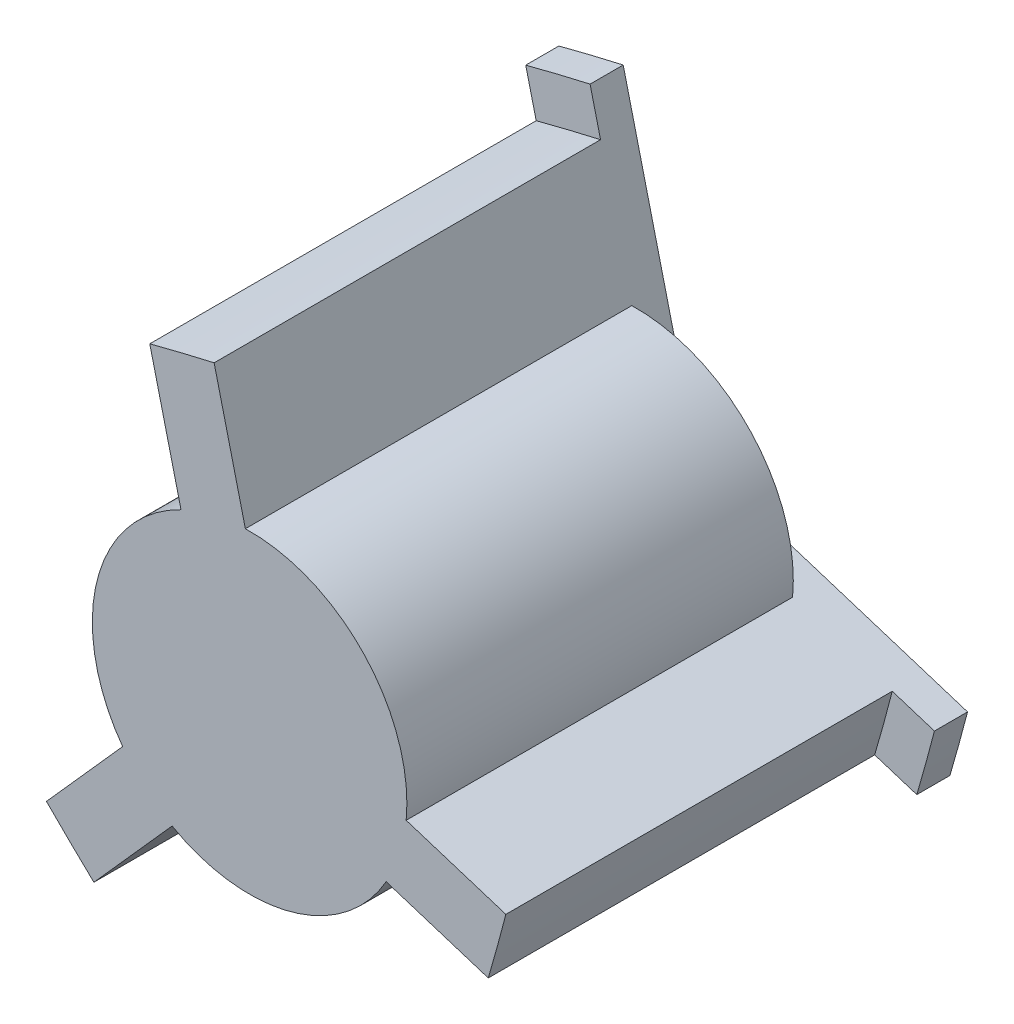
ISO-10303-21;
HEADER;
FILE_DESCRIPTION(('STEP AP214'),'2;1');
FILE_NAME('part.step','',(''),(''),'','','');
FILE_SCHEMA(('AUTOMOTIVE_DESIGN { 1 0 10303 214 1 1 1 1 }'));
ENDSEC;
DATA;
#1=APPLICATION_CONTEXT('core data for automotive mechanical design processes');
#2=APPLICATION_PROTOCOL_DEFINITION('international standard','automotive_design',2000,#1);
#3=PRODUCT_CONTEXT('',#1,'mechanical');
#4=PRODUCT('Part','Part','',(#3));
#5=PRODUCT_RELATED_PRODUCT_CATEGORY('part','',(#4));
#6=PRODUCT_DEFINITION_FORMATION('','',#4);
#7=PRODUCT_DEFINITION_CONTEXT('part definition',#1,'design');
#8=PRODUCT_DEFINITION('design','',#6,#7);
#9=PRODUCT_DEFINITION_SHAPE('','',#8);
#10=(LENGTH_UNIT() NAMED_UNIT(*) SI_UNIT(.MILLI.,.METRE.));
#11=(NAMED_UNIT(*) PLANE_ANGLE_UNIT() SI_UNIT($,.RADIAN.));
#12=(NAMED_UNIT(*) SI_UNIT($,.STERADIAN.) SOLID_ANGLE_UNIT());
#13=UNCERTAINTY_MEASURE_WITH_UNIT(LENGTH_MEASURE(1.E-05),#10,'distance_accuracy_value','');
#14=(GEOMETRIC_REPRESENTATION_CONTEXT(3) GLOBAL_UNCERTAINTY_ASSIGNED_CONTEXT((#13)) GLOBAL_UNIT_ASSIGNED_CONTEXT((#10,
#11,#12)) REPRESENTATION_CONTEXT('',''));
#15=CARTESIAN_POINT('',(0.,0.,0.));
#16=DIRECTION('',(0.,0.,1.));
#17=DIRECTION('',(1.,0.,0.));
#18=AXIS2_PLACEMENT_3D('',#15,#16,#17);
#19=CARTESIAN_POINT('',(0.,0.,-10.));
#20=DIRECTION('',(0.,0.,1.));
#21=DIRECTION('',(1.,0.,0.));
#22=AXIS2_PLACEMENT_3D('',#19,#20,#21);
#23=PLANE('',#22);
#24=DIRECTION('',(-0.236920909085542,0.971528940813438,0.));
#25=VECTOR('',#24,1.);
#26=CARTESIAN_POINT('',(118.726396637085,28.9530909909459,-10.));
#27=LINE('',#26,#25);
#28=CARTESIAN_POINT('',(85.7576937415388,164.146093279056,-10.));
#29=VERTEX_POINT('',#28);
#30=CARTESIAN_POINT('',(82.8313934331884,176.145816942311,-10.));
#31=VERTEX_POINT('',#30);
#32=EDGE_CURVE('E58',#29,#31,#27,.T.);
#33=ORIENTED_EDGE('',*,*,#32,.F.);
#34=DIRECTION('',(0.665010125091396,0.746834341421125,0.));
#35=VECTOR('',#34,1.);
#36=CARTESIAN_POINT('',(-33.691208209572,29.9999522562046,-10.));
#37=LINE('',#36,#35);
#38=CARTESIAN_POINT('',(77.54390061698,154.921658120409,-10.));
#39=VERTEX_POINT('',#38);
#40=EDGE_CURVE('E11',#39,#29,#37,.T.);
#41=ORIENTED_EDGE('',*,*,#40,.F.);
#42=CARTESIAN_POINT('',(89.0453442626024,163.327053586685,-10.));
#43=DIRECTION('',(0.,0.,1.));
#44=DIRECTION('',(1.,0.,0.));
#45=AXIS2_PLACEMENT_3D('',#42,#43,#44);
#46=CIRCLE('',#45,14.2454862633017);
#47=EDGE_CURVE('E410',#39,#31,#46,.F.);
#48=ORIENTED_EDGE('',*,*,#47,.T.);
#49=EDGE_LOOP('',(#33,#41,#48));
#50=FACE_BOUND('',#49,.T.);
#51=ADVANCED_FACE('F39',(#50),#23,.F.);
#52=DIRECTION('',(0.953254848048055,-0.302167494401498,0.));
#53=VECTOR('',#52,1.);
#54=CARTESIAN_POINT('',(56.0819588713388,176.923064765865,-10.));
#55=LINE('',#54,#53);
#56=CARTESIAN_POINT('',(91.560194185412,165.676996106899,-10.));
#57=VERTEX_POINT('',#56);
#58=CARTESIAN_POINT('',(103.226887548505,161.978829232957,-10.));
#59=VERTEX_POINT('',#58);
#60=EDGE_CURVE('E455',#57,#59,#55,.T.);
#61=ORIENTED_EDGE('',*,*,#60,.F.);
#62=DIRECTION('',(-0.236920909085542,0.971528940813438,0.));
#63=VECTOR('',#62,1.);
#64=CARTESIAN_POINT('',(124.555570281965,30.3746164454591,-10.));
#65=LINE('',#64,#63);
#66=CARTESIAN_POINT('',(88.6605670780691,177.567342396824,-10.));
#67=VERTEX_POINT('',#66);
#68=EDGE_CURVE('E213',#57,#67,#65,.T.);
#69=ORIENTED_EDGE('',*,*,#68,.T.);
#70=EDGE_CURVE('E411',#67,#59,#46,.F.);
#71=ORIENTED_EDGE('',*,*,#70,.T.);
#72=EDGE_LOOP('',(#61,#69,#71));
#73=FACE_BOUND('',#72,.T.);
#74=ADVANCED_FACE('F366',(#73),#23,.F.);
#75=CARTESIAN_POINT('',(89.0453442626024,163.327053586685,25.));
#76=DIRECTION('',(0.,0.,-1.));
#77=DIRECTION('',(-1.,0.,0.));
#78=AXIS2_PLACEMENT_3D('',#75,#76,#77);
#79=CYLINDRICAL_SURFACE('',#78,14.2454862633017);
#80=DIRECTION('',(0.,0.,1.));
#81=VECTOR('',#80,1.);
#82=CARTESIAN_POINT('',(77.54390061698,154.921658120409,-26.4995458220875));
#83=LINE('',#82,#81);
#84=CARTESIAN_POINT('',(77.54390061698,154.921658120409,25.));
#85=VERTEX_POINT('',#84);
#86=EDGE_CURVE('E253',#39,#85,#83,.T.);
#87=ORIENTED_EDGE('',*,*,#86,.T.);
#88=CARTESIAN_POINT('',(89.0453442626024,163.327053586685,25.));
#89=DIRECTION('',(0.,0.,1.));
#90=DIRECTION('',(1.,0.,0.));
#91=AXIS2_PLACEMENT_3D('',#88,#89,#90);
#92=CIRCLE('',#91,14.2454862633017);
#93=CARTESIAN_POINT('',(82.8313934331884,176.145816942311,25.));
#94=VERTEX_POINT('',#93);
#95=EDGE_CURVE('E348',#94,#85,#92,.T.);
#96=ORIENTED_EDGE('',*,*,#95,.F.);
#97=DIRECTION('',(0.,0.,1.));
#98=VECTOR('',#97,1.);
#99=CARTESIAN_POINT('',(82.8313934331884,176.145816942311,-26.4995458220875));
#100=LINE('',#99,#98);
#101=EDGE_CURVE('E402',#31,#94,#100,.T.);
#102=ORIENTED_EDGE('',*,*,#101,.F.);
#103=ORIENTED_EDGE('',*,*,#47,.F.);
#104=EDGE_LOOP('',(#87,#96,#102,#103));
#105=FACE_BOUND('',#104,.T.);
#106=ADVANCED_FACE('F425',(#105),#79,.T.);
#107=DIRECTION('',(0.,0.,1.));
#108=VECTOR('',#107,1.);
#109=CARTESIAN_POINT('',(103.226887548505,161.978829232957,-26.4995458220875));
#110=LINE('',#109,#108);
#111=CARTESIAN_POINT('',(103.226887548505,161.978829232957,25.));
#112=VERTEX_POINT('',#111);
#113=EDGE_CURVE('E329',#59,#112,#110,.T.);
#114=ORIENTED_EDGE('',*,*,#113,.F.);
#115=ORIENTED_EDGE('',*,*,#70,.F.);
#116=DIRECTION('',(0.,0.,1.));
#117=VECTOR('',#116,1.);
#118=CARTESIAN_POINT('',(88.6605670780691,177.567342396824,-26.4995458220875));
#119=LINE('',#118,#117);
#120=CARTESIAN_POINT('',(88.6605670780691,177.567342396824,25.));
#121=VERTEX_POINT('',#120);
#122=EDGE_CURVE('E398',#67,#121,#119,.T.);
#123=ORIENTED_EDGE('',*,*,#122,.T.);
#124=EDGE_CURVE('E416',#112,#121,#92,.T.);
#125=ORIENTED_EDGE('',*,*,#124,.F.);
#126=EDGE_LOOP('',(#114,#115,#123,#125));
#127=FACE_BOUND('',#126,.T.);
#128=ADVANCED_FACE('F543',(#127),#79,.T.);
#129=CARTESIAN_POINT('',(82.0249066655067,150.93159736986,25.));
#130=VERTEX_POINT('',#129);
#131=CARTESIAN_POINT('',(101.413882582096,156.259300144668,25.));
#132=VERTEX_POINT('',#131);
#133=EDGE_CURVE('E419',#130,#132,#92,.T.);
#134=ORIENTED_EDGE('',*,*,#133,.F.);
#135=DIRECTION('',(0.,0.,1.));
#136=VECTOR('',#135,1.);
#137=CARTESIAN_POINT('',(82.0249066655067,150.93159736986,-26.4995458220875));
#138=LINE('',#137,#136);
#139=CARTESIAN_POINT('',(82.0249066655067,150.93159736986,-10.));
#140=VERTEX_POINT('',#139);
#141=EDGE_CURVE('E260',#140,#130,#138,.T.);
#142=ORIENTED_EDGE('',*,*,#141,.F.);
#143=CARTESIAN_POINT('',(101.413882582096,156.259300144668,-10.));
#144=VERTEX_POINT('',#143);
#145=EDGE_CURVE('E417',#144,#140,#46,.F.);
#146=ORIENTED_EDGE('',*,*,#145,.F.);
#147=DIRECTION('',(0.,0.,1.));
#148=VECTOR('',#147,1.);
#149=CARTESIAN_POINT('',(101.413882582096,156.259300144668,-26.4995458220875));
#150=LINE('',#149,#148);
#151=EDGE_CURVE('E287',#144,#132,#150,.T.);
#152=ORIENTED_EDGE('',*,*,#151,.T.);
#153=EDGE_LOOP('',(#134,#142,#146,#152));
#154=FACE_BOUND('',#153,.T.);
#155=ADVANCED_FACE('F41',(#154),#79,.T.);
#156=CARTESIAN_POINT('',(0.,0.,25.));
#157=DIRECTION('',(0.,0.,1.));
#158=DIRECTION('',(1.,0.,0.));
#159=AXIS2_PLACEMENT_3D('',#156,#157,#158);
#160=PLANE('',#159);
#161=ORIENTED_EDGE('',*,*,#95,.T.);
#162=DIRECTION('',(0.665010125091396,0.746834341421125,0.));
#163=VECTOR('',#162,1.);
#164=CARTESIAN_POINT('',(-33.691208209572,29.9999522562046,25.));
#165=LINE('',#164,#163);
#166=CARTESIAN_POINT('',(70.6436131604994,147.172345074282,25.));
#167=VERTEX_POINT('',#166);
#168=EDGE_CURVE('E461',#167,#85,#165,.T.);
#169=ORIENTED_EDGE('',*,*,#168,.F.);
#170=CARTESIAN_POINT('',(74.9408453953819,142.975898601314,25.));
#171=CARTESIAN_POINT('',(73.8993035303231,143.959823605304,25.));
#172=CARTESIAN_POINT('',(72.459478207081,145.352579257154,25.));
#173=CARTESIAN_POINT('',(71.0431270383855,146.769030065245,25.));
#174=CARTESIAN_POINT('',(70.6436131604994,147.172345074282,25.));
#175=B_SPLINE_CURVE_WITH_KNOTS('',3,(#170,#171,#172,#173,#174),.UNSPECIFIED.,.F.,.F.,(4,1,4),
(1.546156508371,1.60843396712121,1.63307378554511),.UNSPECIFIED.);
#176=CARTESIAN_POINT('',(74.9408453953819,142.975898601314,25.));
#177=VERTEX_POINT('',#176);
#178=EDGE_CURVE('E491',#167,#177,#175,.F.);
#179=ORIENTED_EDGE('',*,*,#178,.T.);
#180=DIRECTION('',(0.665010125091396,0.746834341421125,0.));
#181=VECTOR('',#180,1.);
#182=CARTESIAN_POINT('',(-29.2102021610452,26.0098915056562,25.));
#183=LINE('',#182,#181);
#184=EDGE_CURVE('E271',#177,#130,#183,.T.);
#185=ORIENTED_EDGE('',*,*,#184,.T.);
#186=ORIENTED_EDGE('',*,*,#133,.T.);
#187=DIRECTION('',(0.953254848048055,-0.302167494401497,0.));
#188=VECTOR('',#187,1.);
#189=CARTESIAN_POINT('',(54.2689539049296,171.203535677576,25.));
#190=LINE('',#189,#188);
#191=CARTESIAN_POINT('',(110.663241636882,153.327392002656,25.));
#192=VERTEX_POINT('',#191);
#193=EDGE_CURVE('E279',#132,#192,#190,.T.);
#194=ORIENTED_EDGE('',*,*,#193,.T.);
#195=CARTESIAN_POINT('',(112.254907626307,159.117082228048,25.));
#196=CARTESIAN_POINT('',(112.092237308255,158.484885528643,25.));
#197=CARTESIAN_POINT('',(111.582887137087,156.548361076597,25.));
#198=CARTESIAN_POINT('',(111.041647466897,154.620407925623,25.));
#199=CARTESIAN_POINT('',(110.663241636882,153.327392002656,25.));
#200=B_SPLINE_CURVE_WITH_KNOTS('',3,(#195,#196,#197,#198,#199),.UNSPECIFIED.,.F.,.F.,(4,1,4),
(1.51148159125971,1.54018762565238,1.59950236118757),.UNSPECIFIED.);
#201=CARTESIAN_POINT('',(112.254907626307,159.117082228048,25.));
#202=VERTEX_POINT('',#201);
#203=EDGE_CURVE('E315',#192,#202,#200,.F.);
#204=ORIENTED_EDGE('',*,*,#203,.T.);
#205=DIRECTION('',(0.953254848048055,-0.302167494401498,0.));
#206=VECTOR('',#205,1.);
#207=CARTESIAN_POINT('',(56.0819588713388,176.923064765865,25.));
#208=LINE('',#207,#206);
#209=EDGE_CURVE('E318',#112,#202,#208,.T.);
#210=ORIENTED_EDGE('',*,*,#209,.F.);
#211=ORIENTED_EDGE('',*,*,#124,.T.);
#212=DIRECTION('',(-0.236920909085542,0.971528940813438,0.));
#213=VECTOR('',#212,1.);
#214=CARTESIAN_POINT('',(124.555570281965,30.3746164454591,25.));
#215=LINE('',#214,#213);
#216=CARTESIAN_POINT('',(85.8313073021829,189.16913712217,25.));
#217=VERTEX_POINT('',#216);
#218=EDGE_CURVE('E380',#121,#217,#215,.T.);
#219=ORIENTED_EDGE('',*,*,#218,.T.);
#220=CARTESIAN_POINT('',(94.9378095260407,190.97441555604,25.));
#221=CARTESIAN_POINT('',(90.9321454966325,190.292183089886,25.));
#222=CARTESIAN_POINT('',(82.9657609262838,188.642806916523,25.));
#223=CARTESIAN_POINT('',(75.1355111940448,186.43678538607,25.));
#224=CARTESIAN_POINT('',(71.3640226827698,185.232339724771,25.));
#225=B_SPLINE_CURVE_WITH_KNOTS('',3,(#220,#221,#222,#223,#224),.UNSPECIFIED.,.F.,.F.,(4,1,4),
(4.53464312649313,4.71238898038469,4.88545253413385),.UNSPECIFIED.);
#226=CARTESIAN_POINT('',(80.0029316180863,187.744339512411,25.));
#227=VERTEX_POINT('',#226);
#228=EDGE_CURVE('E386',#217,#227,#225,.T.);
#229=ORIENTED_EDGE('',*,*,#228,.T.);
#230=DIRECTION('',(-0.236920909085542,0.971528940813438,0.));
#231=VECTOR('',#230,1.);
#232=CARTESIAN_POINT('',(118.726396637085,28.9530909909459,25.));
#233=LINE('',#232,#231);
#234=EDGE_CURVE('E391',#94,#227,#233,.T.);
#235=ORIENTED_EDGE('',*,*,#234,.F.);
#236=EDGE_LOOP('',(#161,#169,#179,#185,#186,#194,#204,#210,#211,#219,#229,#235));
#237=FACE_BOUND('',#236,.T.);
#238=ADVANCED_FACE('F344',(#237),#160,.T.);
#239=ORIENTED_EDGE('',*,*,#145,.T.);
#240=DIRECTION('',(0.665010125091396,0.746834341421125,0.));
#241=VECTOR('',#240,1.);
#242=CARTESIAN_POINT('',(-29.2102021610452,26.0098915056562,-10.));
#243=LINE('',#242,#241);
#244=CARTESIAN_POINT('',(89.9926162271065,159.879670336801,-10.));
#245=VERTEX_POINT('',#244);
#246=EDGE_CURVE('E49',#140,#245,#243,.T.);
#247=ORIENTED_EDGE('',*,*,#246,.T.);
#248=DIRECTION('',(0.953254848048056,-0.302167494401497,0.));
#249=VECTOR('',#248,1.);
#250=CARTESIAN_POINT('',(54.2689539049296,171.203535677576,-10.));
#251=LINE('',#250,#249);
#252=EDGE_CURVE('E447',#245,#144,#251,.T.);
#253=ORIENTED_EDGE('',*,*,#252,.T.);
#254=EDGE_LOOP('',(#239,#247,#253));
#255=FACE_BOUND('',#254,.T.);
#256=ADVANCED_FACE('F361',(#255),#23,.F.);
#257=CARTESIAN_POINT('',(124.555570281965,30.3746164454591,-26.4995458220875));
#258=DIRECTION('',(0.971528940813438,0.236920909085542,0.));
#259=DIRECTION('',(-0.236920909085542,0.971528940813438,0.));
#260=AXIS2_PLACEMENT_3D('',#257,#258,#259);
#261=PLANE('',#260);
#262=ORIENTED_EDGE('',*,*,#122,.F.);
#263=ORIENTED_EDGE('',*,*,#68,.F.);
#264=DIRECTION('',(0.,0.,1.));
#265=VECTOR('',#264,1.);
#266=CARTESIAN_POINT('',(91.560194185412,165.676996106899,-13.));
#267=LINE('',#266,#265);
#268=CARTESIAN_POINT('',(91.560194185412,165.676996106899,-13.));
#269=VERTEX_POINT('',#268);
#270=EDGE_CURVE('E462',#269,#57,#267,.T.);
#271=ORIENTED_EDGE('',*,*,#270,.F.);
#272=DIRECTION('',(-0.236920909085542,0.971528940813438,0.));
#273=VECTOR('',#272,1.);
#274=CARTESIAN_POINT('',(124.555570281965,30.3746164454591,-13.));
#275=LINE('',#274,#273);
#276=CARTESIAN_POINT('',(84.8834924134847,193.055791104962,-13.));
#277=VERTEX_POINT('',#276);
#278=EDGE_CURVE('E208',#269,#277,#275,.T.);
#279=ORIENTED_EDGE('',*,*,#278,.T.);
#280=DIRECTION('',(0.,0.,1.));
#281=VECTOR('',#280,1.);
#282=CARTESIAN_POINT('',(84.8834924134847,193.055791104962,-13.));
#283=LINE('',#282,#281);
#284=CARTESIAN_POINT('',(84.8834924134847,193.055791104962,-10.));
#285=VERTEX_POINT('',#284);
#286=EDGE_CURVE('E212',#277,#285,#283,.T.);
#287=ORIENTED_EDGE('',*,*,#286,.T.);
#288=CARTESIAN_POINT('',(85.8313073021848,189.169137122161,-10.));
#289=VERTEX_POINT('',#288);
#290=EDGE_CURVE('E216',#289,#285,#65,.T.);
#291=ORIENTED_EDGE('',*,*,#290,.F.);
#292=DIRECTION('',(0.,0.,1.));
#293=VECTOR('',#292,1.);
#294=CARTESIAN_POINT('',(85.8313073021829,189.16913712217,-26.4995458220875));
#295=LINE('',#294,#293);
#296=EDGE_CURVE('E397',#289,#217,#295,.T.);
#297=ORIENTED_EDGE('',*,*,#296,.T.);
#298=ORIENTED_EDGE('',*,*,#218,.F.);
#299=EDGE_LOOP('',(#262,#263,#271,#279,#287,#291,#297,#298));
#300=FACE_BOUND('',#299,.T.);
#301=ADVANCED_FACE('F365',(#300),#261,.T.);
#302=CARTESIAN_POINT('',(118.726396637085,28.9530909909459,-26.4995458220875));
#303=DIRECTION('',(0.971528940813438,0.236920909085542,0.));
#304=DIRECTION('',(-0.236920909085542,0.971528940813438,0.));
#305=AXIS2_PLACEMENT_3D('',#302,#303,#304);
#306=PLANE('',#305);
#307=DIRECTION('',(0.,0.,1.));
#308=VECTOR('',#307,1.);
#309=CARTESIAN_POINT('',(80.0029316180863,187.744339512411,-26.4995458220875));
#310=LINE('',#309,#308);
#311=CARTESIAN_POINT('',(80.0029316180863,187.744339512411,-10.));
#312=VERTEX_POINT('',#311);
#313=EDGE_CURVE('E404',#312,#227,#310,.T.);
#314=ORIENTED_EDGE('',*,*,#313,.F.);
#315=CARTESIAN_POINT('',(79.0550987706297,191.631067137727,-10.));
#316=VERTEX_POINT('',#315);
#317=EDGE_CURVE('E203',#312,#316,#27,.T.);
#318=ORIENTED_EDGE('',*,*,#317,.T.);
#319=DIRECTION('',(0.,0.,1.));
#320=VECTOR('',#319,1.);
#321=CARTESIAN_POINT('',(79.0550987706297,191.631067137727,-13.));
#322=LINE('',#321,#320);
#323=CARTESIAN_POINT('',(79.0550987706297,191.631067137727,-13.));
#324=VERTEX_POINT('',#323);
#325=EDGE_CURVE('E200',#324,#316,#322,.T.);
#326=ORIENTED_EDGE('',*,*,#325,.F.);
#327=DIRECTION('',(-0.236920909085542,0.971528940813438,0.));
#328=VECTOR('',#327,1.);
#329=CARTESIAN_POINT('',(118.726396637085,28.9530909909459,-13.));
#330=LINE('',#329,#328);
#331=CARTESIAN_POINT('',(85.7576937415388,164.146093279056,-13.));
#332=VERTEX_POINT('',#331);
#333=EDGE_CURVE('E185',#332,#324,#330,.T.);
#334=ORIENTED_EDGE('',*,*,#333,.F.);
#335=DIRECTION('',(0.,0.,1.));
#336=VECTOR('',#335,1.);
#337=CARTESIAN_POINT('',(85.7576937415388,164.146093279056,-13.));
#338=LINE('',#337,#336);
#339=EDGE_CURVE('E207',#332,#29,#338,.T.);
#340=ORIENTED_EDGE('',*,*,#339,.T.);
#341=ORIENTED_EDGE('',*,*,#32,.T.);
#342=ORIENTED_EDGE('',*,*,#101,.T.);
#343=ORIENTED_EDGE('',*,*,#234,.T.);
#344=EDGE_LOOP('',(#314,#318,#326,#334,#340,#341,#342,#343));
#345=FACE_BOUND('',#344,.T.);
#346=ADVANCED_FACE('F201',(#345),#306,.F.);
#347=CARTESIAN_POINT('',(94.9378095260407,190.97441555604,-26.4995458220875));
#348=CARTESIAN_POINT('',(90.9321454966325,190.292183089886,-26.4995458220875));
#349=CARTESIAN_POINT('',(82.9657609262838,188.642806916523,-26.4995458220875));
#350=CARTESIAN_POINT('',(75.1355111940448,186.43678538607,-26.4995458220875));
#351=CARTESIAN_POINT('',(71.3640226827698,185.232339724771,-26.4995458220875));
#352=B_SPLINE_CURVE_WITH_KNOTS('',3,(#347,#348,#349,#350,#351),.UNSPECIFIED.,.F.,.F.,(4,1,4),
(4.53464312649313,4.71238898038469,4.88545253413385),.UNSPECIFIED.);
#353=DIRECTION('',(0.,0.,1.));
#354=VECTOR('',#353,1.);
#355=SURFACE_OF_LINEAR_EXTRUSION('',#352,#354);
#356=CARTESIAN_POINT('',(94.9378095260407,190.97441555604,-10.));
#357=CARTESIAN_POINT('',(90.9321454966325,190.292183089886,-10.));
#358=CARTESIAN_POINT('',(82.9657609262838,188.642806916523,-10.));
#359=CARTESIAN_POINT('',(75.1355111940448,186.43678538607,-10.));
#360=CARTESIAN_POINT('',(71.3640226827698,185.232339724771,-10.));
#361=B_SPLINE_CURVE_WITH_KNOTS('',3,(#356,#357,#358,#359,#360),.UNSPECIFIED.,.F.,.F.,(4,1,4),
(4.53464312649313,4.71238898038469,4.88545253413385),.UNSPECIFIED.);
#362=EDGE_CURVE('E401',#312,#289,#361,.F.);
#363=ORIENTED_EDGE('',*,*,#362,.F.);
#364=ORIENTED_EDGE('',*,*,#313,.T.);
#365=ORIENTED_EDGE('',*,*,#228,.F.);
#366=ORIENTED_EDGE('',*,*,#296,.F.);
#367=EDGE_LOOP('',(#363,#364,#365,#366));
#368=FACE_BOUND('',#367,.T.);
#369=ADVANCED_FACE('F370',(#368),#355,.T.);
#370=CARTESIAN_POINT('',(54.2689539049296,171.203535677576,-26.4995458220875));
#371=DIRECTION('',(-0.302167494401497,-0.953254848048055,0.));
#372=DIRECTION('',(0.953254848048056,-0.302167494401497,0.));
#373=AXIS2_PLACEMENT_3D('',#370,#371,#372);
#374=PLANE('',#373);
#375=ORIENTED_EDGE('',*,*,#151,.F.);
#376=ORIENTED_EDGE('',*,*,#252,.F.);
#377=DIRECTION('',(0.,0.,1.));
#378=VECTOR('',#377,1.);
#379=CARTESIAN_POINT('',(89.9926162271065,159.879670336801,-13.));
#380=LINE('',#379,#378);
#381=CARTESIAN_POINT('',(89.9926162271065,159.879670336801,-13.));
#382=VERTEX_POINT('',#381);
#383=EDGE_CURVE('E471',#382,#245,#380,.T.);
#384=ORIENTED_EDGE('',*,*,#383,.F.);
#385=DIRECTION('',(0.953254848048056,-0.302167494401497,0.));
#386=VECTOR('',#385,1.);
#387=CARTESIAN_POINT('',(54.2689539049296,171.203535677576,-13.));
#388=LINE('',#387,#386);
#389=CARTESIAN_POINT('',(114.477149219191,152.118440482096,-13.));
#390=VERTEX_POINT('',#389);
#391=EDGE_CURVE('E516',#382,#390,#388,.T.);
#392=ORIENTED_EDGE('',*,*,#391,.T.);
#393=DIRECTION('',(0.,0.,1.));
#394=VECTOR('',#393,1.);
#395=CARTESIAN_POINT('',(114.477149219191,152.118440482096,-13.));
#396=LINE('',#395,#394);
#397=CARTESIAN_POINT('',(114.477149219191,152.118440482096,-10.));
#398=VERTEX_POINT('',#397);
#399=EDGE_CURVE('E468',#390,#398,#396,.T.);
#400=ORIENTED_EDGE('',*,*,#399,.T.);
#401=CARTESIAN_POINT('',(110.663241636882,153.327392002656,-10.));
#402=VERTEX_POINT('',#401);
#403=EDGE_CURVE('E446',#402,#398,#251,.T.);
#404=ORIENTED_EDGE('',*,*,#403,.F.);
#405=DIRECTION('',(0.,0.,1.));
#406=VECTOR('',#405,1.);
#407=CARTESIAN_POINT('',(110.663241636882,153.327392002656,-26.4995458220875));
#408=LINE('',#407,#406);
#409=EDGE_CURVE('E321',#402,#192,#408,.T.);
#410=ORIENTED_EDGE('',*,*,#409,.T.);
#411=ORIENTED_EDGE('',*,*,#193,.F.);
#412=EDGE_LOOP('',(#375,#376,#384,#392,#400,#404,#410,#411));
#413=FACE_BOUND('',#412,.T.);
#414=ADVANCED_FACE('F299',(#413),#374,.T.);
#415=CARTESIAN_POINT('',(56.0819588713388,176.923064765865,-26.4995458220875));
#416=DIRECTION('',(-0.302167494401498,-0.953254848048055,0.));
#417=DIRECTION('',(0.953254848048055,-0.302167494401498,0.));
#418=AXIS2_PLACEMENT_3D('',#415,#416,#417);
#419=PLANE('',#418);
#420=DIRECTION('',(0.,0.,1.));
#421=VECTOR('',#420,1.);
#422=CARTESIAN_POINT('',(112.254907626307,159.117082228048,-26.4995458220875));
#423=LINE('',#422,#421);
#424=CARTESIAN_POINT('',(112.254907626307,159.117082228048,-10.));
#425=VERTEX_POINT('',#424);
#426=EDGE_CURVE('E326',#425,#202,#423,.T.);
#427=ORIENTED_EDGE('',*,*,#426,.F.);
#428=CARTESIAN_POINT('',(116.073596536919,157.906615098108,-10.));
#429=VERTEX_POINT('',#428);
#430=EDGE_CURVE('E454',#425,#429,#55,.T.);
#431=ORIENTED_EDGE('',*,*,#430,.T.);
#432=DIRECTION('',(0.,0.,1.));
#433=VECTOR('',#432,1.);
#434=CARTESIAN_POINT('',(116.073596536919,157.906615098108,-13.));
#435=LINE('',#434,#433);
#436=CARTESIAN_POINT('',(116.073596536919,157.906615098108,-13.));
#437=VERTEX_POINT('',#436);
#438=EDGE_CURVE('E465',#437,#429,#435,.T.);
#439=ORIENTED_EDGE('',*,*,#438,.F.);
#440=DIRECTION('',(0.953254848048055,-0.302167494401498,0.));
#441=VECTOR('',#440,1.);
#442=CARTESIAN_POINT('',(56.0819588713388,176.923064765865,-13.));
#443=LINE('',#442,#441);
#444=EDGE_CURVE('E515',#269,#437,#443,.T.);
#445=ORIENTED_EDGE('',*,*,#444,.F.);
#446=ORIENTED_EDGE('',*,*,#270,.T.);
#447=ORIENTED_EDGE('',*,*,#60,.T.);
#448=ORIENTED_EDGE('',*,*,#113,.T.);
#449=ORIENTED_EDGE('',*,*,#209,.T.);
#450=EDGE_LOOP('',(#427,#431,#439,#445,#446,#447,#448,#449));
#451=FACE_BOUND('',#450,.T.);
#452=ADVANCED_FACE('F297',(#451),#419,.F.);
#453=CARTESIAN_POINT('',(106.726665842432,141.421767448599,-26.4995458220875));
#454=CARTESIAN_POINT('',(108.613071201108,146.514541622576,-26.4995458220875));
#455=CARTESIAN_POINT('',(111.792790798796,156.492930889953,-26.4995458220875));
#456=CARTESIAN_POINT('',(114.10200745988,166.705295070173,-26.4995458220875));
#457=CARTESIAN_POINT('',(114.96877915732,171.410285701265,-26.4995458220875));
#458=B_SPLINE_CURVE_WITH_KNOTS('',3,(#453,#454,#455,#456,#457),.UNSPECIFIED.,.F.,.F.,(4,1,4),
(1.32557193476797,1.5707963267949,1.78545395975945),.UNSPECIFIED.);
#459=DIRECTION('',(0.,0.,1.));
#460=VECTOR('',#459,1.);
#461=SURFACE_OF_LINEAR_EXTRUSION('',#458,#460);
#462=CARTESIAN_POINT('',(106.726665842432,141.421767448599,-10.));
#463=CARTESIAN_POINT('',(108.613071201108,146.514541622576,-10.));
#464=CARTESIAN_POINT('',(111.792790798796,156.492930889953,-10.));
#465=CARTESIAN_POINT('',(114.10200745988,166.705295070173,-10.));
#466=CARTESIAN_POINT('',(114.96877915732,171.410285701265,-10.));
#467=B_SPLINE_CURVE_WITH_KNOTS('',3,(#462,#463,#464,#465,#466),.UNSPECIFIED.,.F.,.F.,(4,1,4),
(1.32557193476797,1.5707963267949,1.78545395975945),.UNSPECIFIED.);
#468=EDGE_CURVE('E335',#425,#402,#467,.F.);
#469=ORIENTED_EDGE('',*,*,#468,.F.);
#470=ORIENTED_EDGE('',*,*,#426,.T.);
#471=ORIENTED_EDGE('',*,*,#203,.F.);
#472=ORIENTED_EDGE('',*,*,#409,.F.);
#473=EDGE_LOOP('',(#469,#470,#471,#472));
#474=FACE_BOUND('',#473,.T.);
#475=ADVANCED_FACE('F293',(#474),#461,.T.);
#476=CARTESIAN_POINT('',(-33.691208209572,29.9999522562046,-26.4995458220875));
#477=DIRECTION('',(0.746834341421125,-0.665010125091396,0.));
#478=DIRECTION('',(0.665010125091397,0.746834341421125,0.));
#479=AXIS2_PLACEMENT_3D('',#476,#477,#478);
#480=PLANE('',#479);
#481=ORIENTED_EDGE('',*,*,#86,.F.);
#482=ORIENTED_EDGE('',*,*,#40,.T.);
#483=ORIENTED_EDGE('',*,*,#339,.F.);
#484=DIRECTION('',(0.665010125091396,0.746834341421125,0.));
#485=VECTOR('',#484,1.);
#486=CARTESIAN_POINT('',(-33.691208209572,29.9999522562046,-13.));
#487=LINE('',#486,#485);
#488=CARTESIAN_POINT('',(67.9784637484142,144.17927018585,-13.));
#489=VERTEX_POINT('',#488);
#490=EDGE_CURVE('E194',#489,#332,#487,.T.);
#491=ORIENTED_EDGE('',*,*,#490,.F.);
#492=DIRECTION('',(0.,0.,1.));
#493=VECTOR('',#492,1.);
#494=CARTESIAN_POINT('',(67.9784637484142,144.17927018585,-13.));
#495=LINE('',#494,#493);
#496=CARTESIAN_POINT('',(67.9784637484142,144.17927018585,-10.));
#497=VERTEX_POINT('',#496);
#498=EDGE_CURVE('E475',#489,#497,#495,.T.);
#499=ORIENTED_EDGE('',*,*,#498,.T.);
#500=CARTESIAN_POINT('',(70.6436131604994,147.172345074282,-10.));
#501=VERTEX_POINT('',#500);
#502=EDGE_CURVE('E51',#497,#501,#37,.T.);
#503=ORIENTED_EDGE('',*,*,#502,.T.);
#504=DIRECTION('',(0.,0.,1.));
#505=VECTOR('',#504,1.);
#506=CARTESIAN_POINT('',(70.6436131604994,147.172345074282,-26.4995458220875));
#507=LINE('',#506,#505);
#508=EDGE_CURVE('E268',#501,#167,#507,.T.);
#509=ORIENTED_EDGE('',*,*,#508,.T.);
#510=ORIENTED_EDGE('',*,*,#168,.T.);
#511=EDGE_LOOP('',(#481,#482,#483,#491,#499,#503,#509,#510));
#512=FACE_BOUND('',#511,.T.);
#513=ADVANCED_FACE('F238',(#512),#480,.F.);
#514=CARTESIAN_POINT('',(-29.2102021610452,26.0098915056562,-26.4995458220875));
#515=DIRECTION('',(0.746834341421125,-0.665010125091396,0.));
#516=DIRECTION('',(0.665010125091396,0.746834341421125,0.));
#517=AXIS2_PLACEMENT_3D('',#514,#515,#516);
#518=PLANE('',#517);
#519=DIRECTION('',(0.,0.,1.));
#520=VECTOR('',#519,1.);
#521=CARTESIAN_POINT('',(74.9408453953819,142.975898601314,-26.4995458220875));
#522=LINE('',#521,#520);
#523=CARTESIAN_POINT('',(74.9408453953819,142.975898601314,-10.));
#524=VERTEX_POINT('',#523);
#525=EDGE_CURVE('E262',#524,#177,#522,.T.);
#526=ORIENTED_EDGE('',*,*,#525,.F.);
#527=CARTESIAN_POINT('',(72.2797051673867,139.987326195246,-10.));
#528=VERTEX_POINT('',#527);
#529=EDGE_CURVE('E440',#528,#524,#243,.T.);
#530=ORIENTED_EDGE('',*,*,#529,.F.);
#531=DIRECTION('',(0.,0.,1.));
#532=VECTOR('',#531,1.);
#533=CARTESIAN_POINT('',(72.2797051673867,139.987326195246,-13.));
#534=LINE('',#533,#532);
#535=CARTESIAN_POINT('',(72.2797051673867,139.987326195246,-13.));
#536=VERTEX_POINT('',#535);
#537=EDGE_CURVE('E473',#536,#528,#534,.T.);
#538=ORIENTED_EDGE('',*,*,#537,.F.);
#539=DIRECTION('',(0.665010125091396,0.746834341421125,0.));
#540=VECTOR('',#539,1.);
#541=CARTESIAN_POINT('',(-29.2102021610452,26.0098915056562,-13.));
#542=LINE('',#541,#540);
#543=EDGE_CURVE('E519',#536,#382,#542,.T.);
#544=ORIENTED_EDGE('',*,*,#543,.T.);
#545=ORIENTED_EDGE('',*,*,#383,.T.);
#546=ORIENTED_EDGE('',*,*,#246,.F.);
#547=ORIENTED_EDGE('',*,*,#141,.T.);
#548=ORIENTED_EDGE('',*,*,#184,.F.);
#549=EDGE_LOOP('',(#526,#530,#538,#544,#545,#546,#547,#548));
#550=FACE_BOUND('',#549,.T.);
#551=ADVANCED_FACE('F234',(#550),#518,.T.);
#552=CARTESIAN_POINT('',(63.1219093678821,155.243821472119,-26.4995458220875));
#553=CARTESIAN_POINT('',(65.8915011768707,152.081919040046,-26.4995458220875));
#554=CARTESIAN_POINT('',(72.3354407319051,145.228643938385,-26.4995458220875));
#555=CARTESIAN_POINT('',(79.2964555277418,138.897312176362,-26.4995458220875));
#556=CARTESIAN_POINT('',(83.1528789991701,135.679691617336,-26.4995458220875));
#557=B_SPLINE_CURVE_WITH_KNOTS('',3,(#552,#553,#554,#555,#556),.UNSPECIFIED.,.F.,.F.,(4,1,4),
(1.38562964798508,1.5707963267949,1.79356186394073),.UNSPECIFIED.);
#558=DIRECTION('',(0.,0.,1.));
#559=VECTOR('',#558,1.);
#560=SURFACE_OF_LINEAR_EXTRUSION('',#557,#559);
#561=CARTESIAN_POINT('',(63.1219093678821,155.243821472119,-10.));
#562=CARTESIAN_POINT('',(65.8915011768707,152.081919040046,-10.));
#563=CARTESIAN_POINT('',(72.3354407319051,145.228643938385,-10.));
#564=CARTESIAN_POINT('',(79.2964555277418,138.897312176362,-10.));
#565=CARTESIAN_POINT('',(83.1528789991701,135.679691617336,-10.));
#566=B_SPLINE_CURVE_WITH_KNOTS('',3,(#561,#562,#563,#564,#565),.UNSPECIFIED.,.F.,.F.,(4,1,4),
(1.38562964798508,1.5707963267949,1.79356186394073),.UNSPECIFIED.);
#567=EDGE_CURVE('E259',#524,#501,#566,.F.);
#568=ORIENTED_EDGE('',*,*,#567,.F.);
#569=ORIENTED_EDGE('',*,*,#525,.T.);
#570=ORIENTED_EDGE('',*,*,#178,.F.);
#571=ORIENTED_EDGE('',*,*,#508,.F.);
#572=EDGE_LOOP('',(#568,#569,#570,#571));
#573=FACE_BOUND('',#572,.T.);
#574=ADVANCED_FACE('F237',(#573),#560,.T.);
#575=CARTESIAN_POINT('',(81.963288026949,192.368064570889,-10.));
#576=DIRECTION('',(0.,0.,-1.));
#577=DIRECTION('',(-1.,0.,0.));
#578=AXIS2_PLACEMENT_3D('',#575,#576,#577);
#579=PLANE('',#578);
#580=ORIENTED_EDGE('',*,*,#430,.F.);
#581=ORIENTED_EDGE('',*,*,#468,.T.);
#582=ORIENTED_EDGE('',*,*,#403,.T.);
#583=CARTESIAN_POINT('',(114.477149219191,152.118440482096,-10.));
#584=CARTESIAN_POINT('',(114.872845179418,153.468054030595,-10.));
#585=CARTESIAN_POINT('',(115.414535278657,155.395796905149,-10.));
#586=CARTESIAN_POINT('',(115.925005377069,157.331931132179,-10.));
#587=CARTESIAN_POINT('',(116.073596536925,157.906615098124,-10.));
#588=B_SPLINE_CURVE_WITH_KNOTS('',3,(#583,#584,#585,#586,#587),.UNSPECIFIED.,.F.,.F.,(4,1,4),
(0.,0.703466766610001,1.),.UNSPECIFIED.);
#589=EDGE_CURVE('E449',#398,#429,#588,.T.);
#590=ORIENTED_EDGE('',*,*,#589,.T.);
#591=EDGE_LOOP('',(#580,#581,#582,#590));
#592=FACE_BOUND('',#591,.T.);
#593=ADVANCED_FACE('F244',(#592),#579,.F.);
#594=ORIENTED_EDGE('',*,*,#529,.T.);
#595=ORIENTED_EDGE('',*,*,#567,.T.);
#596=ORIENTED_EDGE('',*,*,#502,.F.);
#597=CARTESIAN_POINT('',(67.9784637484142,144.17927018585,-10.));
#598=CARTESIAN_POINT('',(68.328483003469,143.826872973503,-10.));
#599=CARTESIAN_POINT('',(69.7457231716809,142.411453643641,-10.));
#600=CARTESIAN_POINT('',(71.1859395947693,141.019226882783,-10.));
#601=CARTESIAN_POINT('',(72.2797051673847,139.987326195248,-10.));
#602=B_SPLINE_CURVE_WITH_KNOTS('',3,(#597,#598,#599,#600,#601),.UNSPECIFIED.,.F.,.F.,(4,1,4),
(0.,0.248018645366052,1.),.UNSPECIFIED.);
#603=EDGE_CURVE('E429',#497,#528,#602,.T.);
#604=ORIENTED_EDGE('',*,*,#603,.T.);
#605=EDGE_LOOP('',(#594,#595,#596,#604));
#606=FACE_BOUND('',#605,.T.);
#607=ADVANCED_FACE('F482',(#606),#579,.F.);
#608=ORIENTED_EDGE('',*,*,#317,.F.);
#609=ORIENTED_EDGE('',*,*,#362,.T.);
#610=ORIENTED_EDGE('',*,*,#290,.T.);
#611=CARTESIAN_POINT('',(84.8834924134837,193.055791104962,-10.));
#612=CARTESIAN_POINT('',(83.9022417721924,192.833423276844,-10.));
#613=CARTESIAN_POINT('',(81.9548901499884,192.374735190798,-10.));
#614=CARTESIAN_POINT('',(80.015590861784,191.883121702286,-10.));
#615=CARTESIAN_POINT('',(79.0550987706308,191.631067137727,-10.));
#616=B_SPLINE_CURVE_WITH_KNOTS('',3,(#611,#612,#613,#614,#615),.UNSPECIFIED.,.F.,.F.,(4,1,4),
(0.,0.503285454201741,1.),.UNSPECIFIED.);
#617=EDGE_CURVE('E430',#285,#316,#616,.T.);
#618=ORIENTED_EDGE('',*,*,#617,.T.);
#619=EDGE_LOOP('',(#608,#609,#610,#618));
#620=FACE_BOUND('',#619,.T.);
#621=ADVANCED_FACE('F230',(#620),#579,.F.);
#622=CARTESIAN_POINT('',(84.8834924134837,193.055791104962,-13.));
#623=CARTESIAN_POINT('',(83.9022417721924,192.833423276844,-13.));
#624=CARTESIAN_POINT('',(81.9548901499884,192.374735190798,-13.));
#625=CARTESIAN_POINT('',(80.015590861784,191.883121702286,-13.));
#626=CARTESIAN_POINT('',(79.0550987706308,191.631067137727,-13.));
#627=B_SPLINE_CURVE_WITH_KNOTS('',3,(#622,#623,#624,#625,#626),.UNSPECIFIED.,.F.,.F.,(4,1,4),
(0.,0.503285454201741,1.),.UNSPECIFIED.);
#628=DIRECTION('',(0.,0.,1.));
#629=VECTOR('',#628,1.);
#630=SURFACE_OF_LINEAR_EXTRUSION('',#627,#629);
#631=ORIENTED_EDGE('',*,*,#617,.F.);
#632=ORIENTED_EDGE('',*,*,#286,.F.);
#633=EDGE_CURVE('E190',#277,#324,#627,.T.);
#634=ORIENTED_EDGE('',*,*,#633,.T.);
#635=ORIENTED_EDGE('',*,*,#325,.T.);
#636=EDGE_LOOP('',(#631,#632,#634,#635));
#637=FACE_BOUND('',#636,.T.);
#638=ADVANCED_FACE('F210',(#637),#630,.T.);
#639=CARTESIAN_POINT('',(114.477149219191,152.118440482096,-13.));
#640=CARTESIAN_POINT('',(114.872845179418,153.468054030595,-13.));
#641=CARTESIAN_POINT('',(115.414535278657,155.395796905149,-13.));
#642=CARTESIAN_POINT('',(115.925005377069,157.331931132179,-13.));
#643=CARTESIAN_POINT('',(116.073596536925,157.906615098124,-13.));
#644=B_SPLINE_CURVE_WITH_KNOTS('',3,(#639,#640,#641,#642,#643),.UNSPECIFIED.,.F.,.F.,(4,1,4),
(0.,0.703466766610001,1.),.UNSPECIFIED.);
#645=DIRECTION('',(0.,0.,1.));
#646=VECTOR('',#645,1.);
#647=SURFACE_OF_LINEAR_EXTRUSION('',#644,#646);
#648=ORIENTED_EDGE('',*,*,#589,.F.);
#649=ORIENTED_EDGE('',*,*,#399,.F.);
#650=EDGE_CURVE('E512',#390,#437,#644,.T.);
#651=ORIENTED_EDGE('',*,*,#650,.T.);
#652=ORIENTED_EDGE('',*,*,#438,.T.);
#653=EDGE_LOOP('',(#648,#649,#651,#652));
#654=FACE_BOUND('',#653,.T.);
#655=ADVANCED_FACE('F229',(#654),#647,.T.);
#656=CARTESIAN_POINT('',(67.9784637484142,144.17927018585,-13.));
#657=CARTESIAN_POINT('',(68.328483003469,143.826872973503,-13.));
#658=CARTESIAN_POINT('',(69.7457231716809,142.411453643641,-13.));
#659=CARTESIAN_POINT('',(71.1859395947693,141.019226882783,-13.));
#660=CARTESIAN_POINT('',(72.2797051673847,139.987326195248,-13.));
#661=B_SPLINE_CURVE_WITH_KNOTS('',3,(#656,#657,#658,#659,#660),.UNSPECIFIED.,.F.,.F.,(4,1,4),
(0.,0.248018645366052,1.),.UNSPECIFIED.);
#662=DIRECTION('',(0.,0.,1.));
#663=VECTOR('',#662,1.);
#664=SURFACE_OF_LINEAR_EXTRUSION('',#661,#663);
#665=ORIENTED_EDGE('',*,*,#603,.F.);
#666=ORIENTED_EDGE('',*,*,#498,.F.);
#667=EDGE_CURVE('E485',#489,#536,#661,.T.);
#668=ORIENTED_EDGE('',*,*,#667,.T.);
#669=ORIENTED_EDGE('',*,*,#537,.T.);
#670=EDGE_LOOP('',(#665,#666,#668,#669));
#671=FACE_BOUND('',#670,.T.);
#672=ADVANCED_FACE('F231',(#671),#664,.T.);
#673=CARTESIAN_POINT('',(81.963288026949,192.368064570889,-13.));
#674=DIRECTION('',(0.,0.,-1.));
#675=DIRECTION('',(-1.,0.,0.));
#676=AXIS2_PLACEMENT_3D('',#673,#674,#675);
#677=PLANE('',#676);
#678=ORIENTED_EDGE('',*,*,#633,.F.);
#679=ORIENTED_EDGE('',*,*,#278,.F.);
#680=ORIENTED_EDGE('',*,*,#444,.T.);
#681=ORIENTED_EDGE('',*,*,#650,.F.);
#682=ORIENTED_EDGE('',*,*,#391,.F.);
#683=ORIENTED_EDGE('',*,*,#543,.F.);
#684=ORIENTED_EDGE('',*,*,#667,.F.);
#685=ORIENTED_EDGE('',*,*,#490,.T.);
#686=ORIENTED_EDGE('',*,*,#333,.T.);
#687=EDGE_LOOP('',(#678,#679,#680,#681,#682,#683,#684,#685,#686));
#688=FACE_BOUND('',#687,.T.);
#689=ADVANCED_FACE('F187',(#688),#677,.T.);
#690=CLOSED_SHELL('',(#51,#74,#106,#128,#155,#238,#256,#301,#346,#369,#414,#452,#475,#513,#551,
#574,#593,#607,#621,#638,#655,#672,#689));
#691=MANIFOLD_SOLID_BREP('B2',#690);
#692=ADVANCED_BREP_SHAPE_REPRESENTATION('',(#18,#691),#14);
#693=SHAPE_DEFINITION_REPRESENTATION(#9,#692);
ENDSEC;
END-ISO-10303-21;
